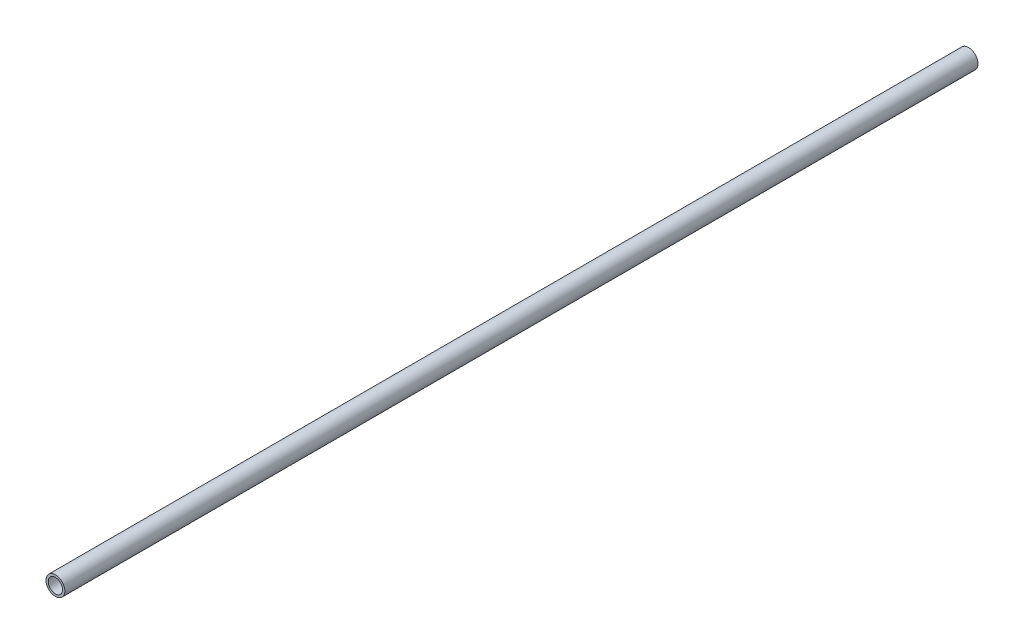
ISO-10303-21;
HEADER;
FILE_DESCRIPTION(('STEP AP214'),'2;1');
FILE_NAME('part.step','',(''),(''),'','','');
FILE_SCHEMA(('AUTOMOTIVE_DESIGN { 1 0 10303 214 1 1 1 1 }'));
ENDSEC;
DATA;
#1=APPLICATION_CONTEXT('core data for automotive mechanical design processes');
#2=APPLICATION_PROTOCOL_DEFINITION('international standard','automotive_design',2000,#1);
#3=PRODUCT_CONTEXT('',#1,'mechanical');
#4=PRODUCT('Part','Part','',(#3));
#5=PRODUCT_RELATED_PRODUCT_CATEGORY('part','',(#4));
#6=PRODUCT_DEFINITION_FORMATION('','',#4);
#7=PRODUCT_DEFINITION_CONTEXT('part definition',#1,'design');
#8=PRODUCT_DEFINITION('design','',#6,#7);
#9=PRODUCT_DEFINITION_SHAPE('','',#8);
#10=(LENGTH_UNIT() NAMED_UNIT(*) SI_UNIT(.MILLI.,.METRE.));
#11=(NAMED_UNIT(*) PLANE_ANGLE_UNIT() SI_UNIT($,.RADIAN.));
#12=(NAMED_UNIT(*) SI_UNIT($,.STERADIAN.) SOLID_ANGLE_UNIT());
#13=UNCERTAINTY_MEASURE_WITH_UNIT(LENGTH_MEASURE(1.E-05),#10,'distance_accuracy_value','');
#14=(GEOMETRIC_REPRESENTATION_CONTEXT(3) GLOBAL_UNCERTAINTY_ASSIGNED_CONTEXT((#13)) GLOBAL_UNIT_ASSIGNED_CONTEXT((#10,
#11,#12)) REPRESENTATION_CONTEXT('',''));
#15=CARTESIAN_POINT('',(0.,0.,0.));
#16=DIRECTION('',(0.,0.,1.));
#17=DIRECTION('',(1.,0.,0.));
#18=AXIS2_PLACEMENT_3D('',#15,#16,#17);
#19=CARTESIAN_POINT('',(0.,0.,1618.996));
#20=DIRECTION('',(0.,0.,1.));
#21=DIRECTION('',(1.,0.,0.));
#22=AXIS2_PLACEMENT_3D('',#19,#20,#21);
#23=PLANE('',#22);
#24=CARTESIAN_POINT('',(0.,0.,1618.996));
#25=DIRECTION('',(0.,0.,1.));
#26=DIRECTION('',(1.,0.,0.));
#27=AXIS2_PLACEMENT_3D('',#24,#25,#26);
#28=CIRCLE('',#27,16.7005);
#29=CARTESIAN_POINT('',(16.7005,0.,1618.996));
#30=VERTEX_POINT('',#29);
#31=EDGE_CURVE('E10',#30,#30,#28,.T.);
#32=ORIENTED_EDGE('',*,*,#31,.T.);
#33=EDGE_LOOP('',(#32));
#34=FACE_BOUND('',#33,.T.);
#35=CARTESIAN_POINT('',(0.,0.,1618.996));
#36=DIRECTION('',(0.,0.,1.));
#37=DIRECTION('',(1.,0.,0.));
#38=AXIS2_PLACEMENT_3D('',#35,#36,#37);
#39=CIRCLE('',#38,12.7);
#40=CARTESIAN_POINT('',(12.7,0.,1618.996));
#41=VERTEX_POINT('',#40);
#42=EDGE_CURVE('E44',#41,#41,#39,.T.);
#43=ORIENTED_EDGE('',*,*,#42,.F.);
#44=EDGE_LOOP('',(#43));
#45=FACE_BOUND('',#44,.T.);
#46=ADVANCED_FACE('F33',(#34,#45),#23,.T.);
#47=CARTESIAN_POINT('',(0.,0.,0.));
#48=DIRECTION('',(0.,0.,1.));
#49=DIRECTION('',(1.,0.,0.));
#50=AXIS2_PLACEMENT_3D('',#47,#48,#49);
#51=PLANE('',#50);
#52=CARTESIAN_POINT('',(0.,0.,0.));
#53=DIRECTION('',(0.,0.,1.));
#54=DIRECTION('',(1.,0.,0.));
#55=AXIS2_PLACEMENT_3D('',#52,#53,#54);
#56=CIRCLE('',#55,16.7005);
#57=CARTESIAN_POINT('',(16.7005,0.,0.));
#58=VERTEX_POINT('',#57);
#59=EDGE_CURVE('E37',#58,#58,#56,.T.);
#60=ORIENTED_EDGE('',*,*,#59,.F.);
#61=EDGE_LOOP('',(#60));
#62=FACE_BOUND('',#61,.T.);
#63=CARTESIAN_POINT('',(0.,0.,0.));
#64=DIRECTION('',(0.,0.,1.));
#65=DIRECTION('',(1.,0.,0.));
#66=AXIS2_PLACEMENT_3D('',#63,#64,#65);
#67=CIRCLE('',#66,12.7);
#68=CARTESIAN_POINT('',(12.7,0.,0.));
#69=VERTEX_POINT('',#68);
#70=EDGE_CURVE('E46',#69,#69,#67,.T.);
#71=ORIENTED_EDGE('',*,*,#70,.T.);
#72=EDGE_LOOP('',(#71));
#73=FACE_BOUND('',#72,.T.);
#74=ADVANCED_FACE('F56',(#62,#73),#51,.F.);
#75=CARTESIAN_POINT('',(0.,0.,1618.996));
#76=DIRECTION('',(0.,0.,-1.));
#77=DIRECTION('',(-1.,0.,0.));
#78=AXIS2_PLACEMENT_3D('',#75,#76,#77);
#79=CYLINDRICAL_SURFACE('',#78,16.7005);
#80=ORIENTED_EDGE('',*,*,#31,.F.);
#81=EDGE_LOOP('',(#80));
#82=FACE_BOUND('',#81,.T.);
#83=ORIENTED_EDGE('',*,*,#59,.T.);
#84=EDGE_LOOP('',(#83));
#85=FACE_BOUND('',#84,.T.);
#86=ADVANCED_FACE('F35',(#82,#85),#79,.T.);
#87=CARTESIAN_POINT('',(0.,0.,1618.996));
#88=DIRECTION('',(0.,0.,-1.));
#89=DIRECTION('',(-1.,0.,0.));
#90=AXIS2_PLACEMENT_3D('',#87,#88,#89);
#91=CYLINDRICAL_SURFACE('',#90,12.7);
#92=ORIENTED_EDGE('',*,*,#42,.T.);
#93=EDGE_LOOP('',(#92));
#94=FACE_BOUND('',#93,.T.);
#95=ORIENTED_EDGE('',*,*,#70,.F.);
#96=EDGE_LOOP('',(#95));
#97=FACE_BOUND('',#96,.T.);
#98=ADVANCED_FACE('F52',(#94,#97),#91,.F.);
#99=CLOSED_SHELL('',(#46,#74,#86,#98));
#100=MANIFOLD_SOLID_BREP('B2',#99);
#101=ADVANCED_BREP_SHAPE_REPRESENTATION('',(#18,#100),#14);
#102=SHAPE_DEFINITION_REPRESENTATION(#9,#101);
ENDSEC;
END-ISO-10303-21;
